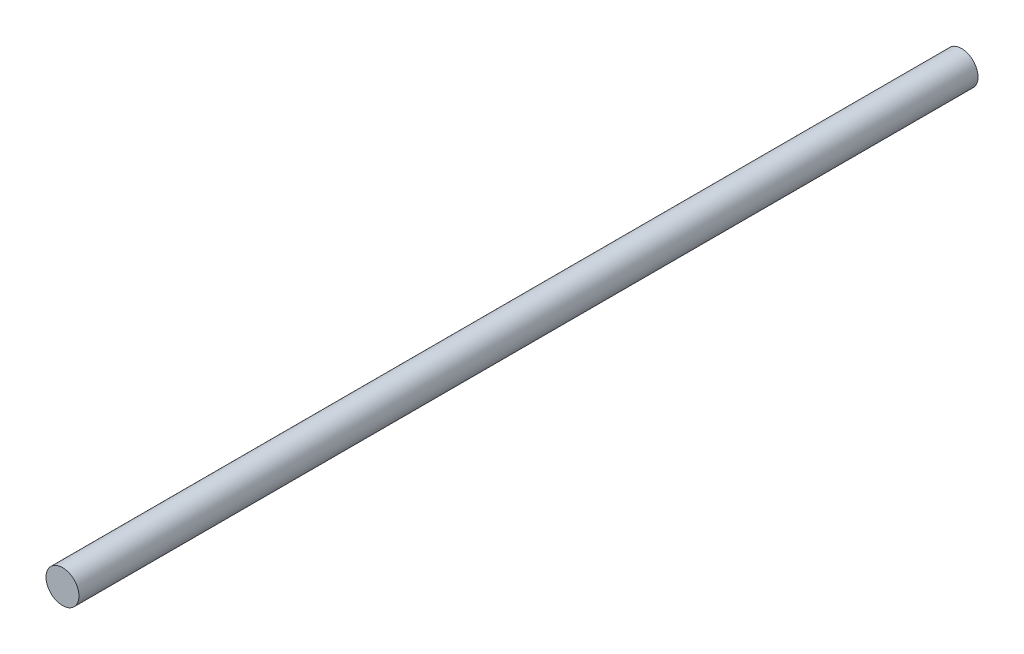
ISO-10303-21;
HEADER;
FILE_DESCRIPTION(('STEP AP214'),'2;1');
FILE_NAME('part.step','',(''),(''),'','','');
FILE_SCHEMA(('AUTOMOTIVE_DESIGN { 1 0 10303 214 1 1 1 1 }'));
ENDSEC;
DATA;
#1=APPLICATION_CONTEXT('core data for automotive mechanical design processes');
#2=APPLICATION_PROTOCOL_DEFINITION('international standard','automotive_design',2000,#1);
#3=PRODUCT_CONTEXT('',#1,'mechanical');
#4=PRODUCT('Part','Part','',(#3));
#5=PRODUCT_RELATED_PRODUCT_CATEGORY('part','',(#4));
#6=PRODUCT_DEFINITION_FORMATION('','',#4);
#7=PRODUCT_DEFINITION_CONTEXT('part definition',#1,'design');
#8=PRODUCT_DEFINITION('design','',#6,#7);
#9=PRODUCT_DEFINITION_SHAPE('','',#8);
#10=(LENGTH_UNIT() NAMED_UNIT(*) SI_UNIT(.MILLI.,.METRE.));
#11=(NAMED_UNIT(*) PLANE_ANGLE_UNIT() SI_UNIT($,.RADIAN.));
#12=(NAMED_UNIT(*) SI_UNIT($,.STERADIAN.) SOLID_ANGLE_UNIT());
#13=UNCERTAINTY_MEASURE_WITH_UNIT(LENGTH_MEASURE(1.E-05),#10,'distance_accuracy_value','');
#14=(GEOMETRIC_REPRESENTATION_CONTEXT(3) GLOBAL_UNCERTAINTY_ASSIGNED_CONTEXT((#13)) GLOBAL_UNIT_ASSIGNED_CONTEXT((#10,
#11,#12)) REPRESENTATION_CONTEXT('',''));
#15=CARTESIAN_POINT('',(0.,0.,0.));
#16=DIRECTION('',(0.,0.,1.));
#17=DIRECTION('',(1.,0.,0.));
#18=AXIS2_PLACEMENT_3D('',#15,#16,#17);
#19=CARTESIAN_POINT('',(0.,0.,218.26));
#20=DIRECTION('',(0.,0.,-1.));
#21=DIRECTION('',(-1.,0.,0.));
#22=AXIS2_PLACEMENT_3D('',#19,#20,#21);
#23=CYLINDRICAL_SURFACE('',#22,4.);
#24=CARTESIAN_POINT('',(0.,0.,218.26));
#25=DIRECTION('',(0.,0.,1.));
#26=DIRECTION('',(1.,0.,0.));
#27=AXIS2_PLACEMENT_3D('',#24,#25,#26);
#28=CIRCLE('',#27,4.);
#29=CARTESIAN_POINT('',(-4.,0.,218.26));
#30=VERTEX_POINT('',#29);
#31=EDGE_CURVE('E10',#30,#30,#28,.T.);
#32=CARTESIAN_POINT('',(0.,0.,0.));
#33=DIRECTION('',(0.,0.,1.));
#34=DIRECTION('',(1.,0.,0.));
#35=AXIS2_PLACEMENT_3D('',#32,#33,#34);
#36=CIRCLE('',#35,4.);
#37=CARTESIAN_POINT('',(-4.,0.,0.));
#38=VERTEX_POINT('',#37);
#39=EDGE_CURVE('E35',#38,#38,#36,.T.);
#40=CARTESIAN_POINT('',(-4.,0.,218.26));
#41=CARTESIAN_POINT('',(-4.,0.,215.986458333333));
#42=CARTESIAN_POINT('',(-4.,0.,213.712916666667));
#43=CARTESIAN_POINT('',(-4.,0.,209.165833333333));
#44=CARTESIAN_POINT('',(-4.,0.,206.892291666667));
#45=CARTESIAN_POINT('',(-4.,0.,202.345208333333));
#46=CARTESIAN_POINT('',(-4.,0.,200.071666666667));
#47=CARTESIAN_POINT('',(-4.,0.,195.524583333333));
#48=CARTESIAN_POINT('',(-4.,0.,193.251041666667));
#49=CARTESIAN_POINT('',(-4.,0.,188.703958333333));
#50=CARTESIAN_POINT('',(-4.,0.,186.430416666667));
#51=CARTESIAN_POINT('',(-4.,0.,181.883333333333));
#52=CARTESIAN_POINT('',(-4.,0.,179.609791666667));
#53=CARTESIAN_POINT('',(-4.,0.,175.062708333333));
#54=CARTESIAN_POINT('',(-4.,0.,172.789166666667));
#55=CARTESIAN_POINT('',(-4.,0.,168.242083333333));
#56=CARTESIAN_POINT('',(-4.,0.,165.968541666667));
#57=CARTESIAN_POINT('',(-4.,0.,161.421458333333));
#58=CARTESIAN_POINT('',(-4.,0.,159.147916666667));
#59=CARTESIAN_POINT('',(-4.,0.,154.600833333333));
#60=CARTESIAN_POINT('',(-4.,0.,152.327291666667));
#61=CARTESIAN_POINT('',(-4.,0.,147.780208333333));
#62=CARTESIAN_POINT('',(-4.,0.,145.506666666667));
#63=CARTESIAN_POINT('',(-4.,0.,140.959583333333));
#64=CARTESIAN_POINT('',(-4.,0.,138.686041666667));
#65=CARTESIAN_POINT('',(-4.,0.,134.138958333333));
#66=CARTESIAN_POINT('',(-4.,0.,131.865416666667));
#67=CARTESIAN_POINT('',(-4.,0.,127.318333333333));
#68=CARTESIAN_POINT('',(-4.,0.,125.044791666667));
#69=CARTESIAN_POINT('',(-4.,0.,120.497708333333));
#70=CARTESIAN_POINT('',(-4.,0.,118.224166666667));
#71=CARTESIAN_POINT('',(-4.,0.,113.677083333333));
#72=CARTESIAN_POINT('',(-4.,0.,111.403541666667));
#73=CARTESIAN_POINT('',(-4.,0.,106.856458333333));
#74=CARTESIAN_POINT('',(-4.,0.,104.582916666667));
#75=CARTESIAN_POINT('',(-4.,0.,100.035833333333));
#76=CARTESIAN_POINT('',(-4.,0.,97.7622916666667));
#77=CARTESIAN_POINT('',(-4.,0.,93.2152083333333));
#78=CARTESIAN_POINT('',(-4.,0.,90.9416666666667));
#79=CARTESIAN_POINT('',(-4.,0.,86.3945833333333));
#80=CARTESIAN_POINT('',(-4.,0.,84.1210416666667));
#81=CARTESIAN_POINT('',(-4.,0.,79.5739583333334));
#82=CARTESIAN_POINT('',(-4.,0.,77.3004166666667));
#83=CARTESIAN_POINT('',(-4.,0.,72.7533333333333));
#84=CARTESIAN_POINT('',(-4.,0.,70.4797916666667));
#85=CARTESIAN_POINT('',(-4.,0.,65.9327083333333));
#86=CARTESIAN_POINT('',(-4.,0.,63.6591666666667));
#87=CARTESIAN_POINT('',(-4.,0.,59.1120833333333));
#88=CARTESIAN_POINT('',(-4.,0.,56.8385416666667));
#89=CARTESIAN_POINT('',(-4.,0.,52.2914583333333));
#90=CARTESIAN_POINT('',(-4.,0.,50.0179166666667));
#91=CARTESIAN_POINT('',(-4.,0.,45.4708333333333));
#92=CARTESIAN_POINT('',(-4.,0.,43.1972916666667));
#93=CARTESIAN_POINT('',(-4.,0.,38.6502083333333));
#94=CARTESIAN_POINT('',(-4.,0.,36.3766666666667));
#95=CARTESIAN_POINT('',(-4.,0.,31.8295833333333));
#96=CARTESIAN_POINT('',(-4.,0.,29.5560416666667));
#97=CARTESIAN_POINT('',(-4.,0.,25.0089583333333));
#98=CARTESIAN_POINT('',(-4.,0.,22.7354166666667));
#99=CARTESIAN_POINT('',(-4.,0.,18.1883333333333));
#100=CARTESIAN_POINT('',(-4.,0.,15.9147916666667));
#101=CARTESIAN_POINT('',(-4.,0.,11.3677083333333));
#102=CARTESIAN_POINT('',(-4.,0.,9.09416666666666));
#103=CARTESIAN_POINT('',(-4.,0.,4.54708333333333));
#104=CARTESIAN_POINT('',(-4.,0.,2.27354166666667));
#105=CARTESIAN_POINT('',(-4.,0.,0.));
#106=B_SPLINE_CURVE_WITH_KNOTS('',3,(#40,#41,#42,#43,#44,#45,#46,#47,#48,#49,#50,#51,#52,#53,
#54,#55,#56,#57,#58,#59,#60,#61,#62,#63,#64,#65,#66,#67,#68,#69,#70,#71,#72,#73,#74,#75,#76,#77,
#78,#79,#80,#81,#82,#83,#84,#85,#86,#87,#88,#89,#90,#91,#92,#93,#94,#95,#96,#97,#98,#99,#100,
#101,#102,#103,#104,#105),.UNSPECIFIED.,.F.,.F.,(4,2,2,2,2,2,2,2,2,2,2,2,2,2,2,2,2,2,2,2,2,2,2,
2,2,2,2,2,2,2,2,2,4),(0.,6.82062500000002,13.64125,20.461875,27.2825,34.103125,40.92375,
47.744375,54.565,61.385625,68.20625,75.026875,81.8475,88.668125,95.48875,102.309375,109.13,
115.950625,122.77125,129.591875,136.4125,143.233125,150.05375,156.874375,163.695,170.515625,
177.33625,184.156875,190.9775,197.798125,204.61875,211.439375,218.26),.UNSPECIFIED.);
#107=EDGE_CURVE('BSEAM32',#30,#38,#106,.T.);
#108=ORIENTED_EDGE('',*,*,#31,.F.);
#109=ORIENTED_EDGE('',*,*,#39,.T.);
#110=ORIENTED_EDGE('',*,*,#107,.T.);
#111=ORIENTED_EDGE('',*,*,#107,.F.);
#112=EDGE_LOOP('',(#108,#110,#109,#111));
#113=FACE_BOUND('',#112,.T.);
#114=ADVANCED_FACE('F32',(#113),#23,.T.);
#115=CARTESIAN_POINT('',(0.,0.,218.26));
#116=DIRECTION('',(0.,0.,1.));
#117=DIRECTION('',(1.,0.,0.));
#118=AXIS2_PLACEMENT_3D('',#115,#116,#117);
#119=PLANE('',#118);
#120=ORIENTED_EDGE('',*,*,#31,.T.);
#121=EDGE_LOOP('',(#120));
#122=FACE_BOUND('',#121,.T.);
#123=ADVANCED_FACE('F47',(#122),#119,.T.);
#124=CARTESIAN_POINT('',(0.,0.,0.));
#125=DIRECTION('',(0.,0.,1.));
#126=DIRECTION('',(1.,0.,0.));
#127=AXIS2_PLACEMENT_3D('',#124,#125,#126);
#128=PLANE('',#127);
#129=ORIENTED_EDGE('',*,*,#39,.F.);
#130=EDGE_LOOP('',(#129));
#131=FACE_BOUND('',#130,.T.);
#132=ADVANCED_FACE('F45',(#131),#128,.F.);
#133=CLOSED_SHELL('',(#114,#123,#132));
#134=MANIFOLD_SOLID_BREP('B2',#133);
#135=ADVANCED_BREP_SHAPE_REPRESENTATION('',(#18,#134),#14);
#136=SHAPE_DEFINITION_REPRESENTATION(#9,#135);
ENDSEC;
END-ISO-10303-21;
